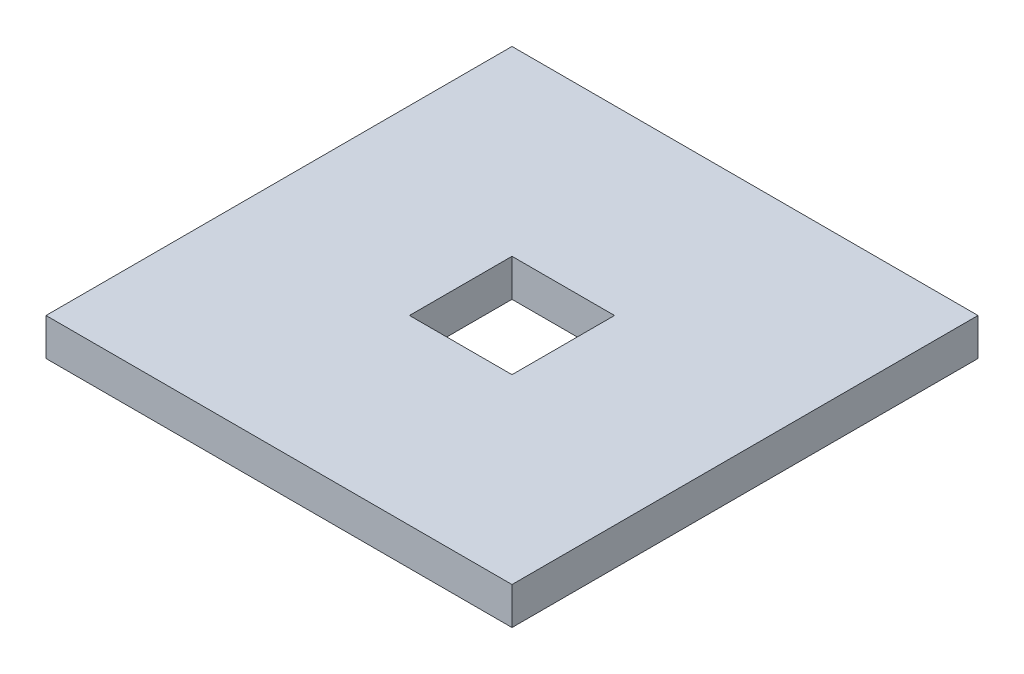
ISO-10303-21;
HEADER;
FILE_DESCRIPTION(('STEP AP214'),'2;1');
FILE_NAME('part.step','',(''),(''),'','','');
FILE_SCHEMA(('AUTOMOTIVE_DESIGN { 1 0 10303 214 1 1 1 1 }'));
ENDSEC;
DATA;
#1=APPLICATION_CONTEXT('core data for automotive mechanical design processes');
#2=APPLICATION_PROTOCOL_DEFINITION('international standard','automotive_design',2000,#1);
#3=PRODUCT_CONTEXT('',#1,'mechanical');
#4=PRODUCT('Part','Part','',(#3));
#5=PRODUCT_RELATED_PRODUCT_CATEGORY('part','',(#4));
#6=PRODUCT_DEFINITION_FORMATION('','',#4);
#7=PRODUCT_DEFINITION_CONTEXT('part definition',#1,'design');
#8=PRODUCT_DEFINITION('design','',#6,#7);
#9=PRODUCT_DEFINITION_SHAPE('','',#8);
#10=(LENGTH_UNIT() NAMED_UNIT(*) SI_UNIT(.MILLI.,.METRE.));
#11=(NAMED_UNIT(*) PLANE_ANGLE_UNIT() SI_UNIT($,.RADIAN.));
#12=(NAMED_UNIT(*) SI_UNIT($,.STERADIAN.) SOLID_ANGLE_UNIT());
#13=UNCERTAINTY_MEASURE_WITH_UNIT(LENGTH_MEASURE(1.E-05),#10,'distance_accuracy_value','');
#14=(GEOMETRIC_REPRESENTATION_CONTEXT(3) GLOBAL_UNCERTAINTY_ASSIGNED_CONTEXT((#13)) GLOBAL_UNIT_ASSIGNED_CONTEXT((#10,
#11,#12)) REPRESENTATION_CONTEXT('',''));
#15=CARTESIAN_POINT('',(0.,0.,0.));
#16=DIRECTION('',(0.,0.,1.));
#17=DIRECTION('',(1.,0.,0.));
#18=AXIS2_PLACEMENT_3D('',#15,#16,#17);
#19=CARTESIAN_POINT('',(0.,20.,0.));
#20=DIRECTION('',(0.,1.,0.));
#21=DIRECTION('',(0.,0.,1.));
#22=AXIS2_PLACEMENT_3D('',#19,#20,#21);
#23=PLANE('',#22);
#24=DIRECTION('',(0.,0.,1.));
#25=VECTOR('',#24,1.);
#26=CARTESIAN_POINT('',(-125.,20.,125.));
#27=LINE('',#26,#25);
#28=CARTESIAN_POINT('',(-125.,20.,-125.));
#29=VERTEX_POINT('',#28);
#30=CARTESIAN_POINT('',(-125.,20.,125.));
#31=VERTEX_POINT('',#30);
#32=EDGE_CURVE('E145',#29,#31,#27,.T.);
#33=ORIENTED_EDGE('',*,*,#32,.T.);
#34=DIRECTION('',(1.,0.,0.));
#35=VECTOR('',#34,1.);
#36=CARTESIAN_POINT('',(125.,20.,125.));
#37=LINE('',#36,#35);
#38=CARTESIAN_POINT('',(125.,20.,125.));
#39=VERTEX_POINT('',#38);
#40=EDGE_CURVE('E144',#31,#39,#37,.T.);
#41=ORIENTED_EDGE('',*,*,#40,.T.);
#42=DIRECTION('',(0.,0.,-1.));
#43=VECTOR('',#42,1.);
#44=CARTESIAN_POINT('',(125.,20.,125.));
#45=LINE('',#44,#43);
#46=CARTESIAN_POINT('',(125.,20.,-125.));
#47=VERTEX_POINT('',#46);
#48=EDGE_CURVE('E149',#39,#47,#45,.T.);
#49=ORIENTED_EDGE('',*,*,#48,.T.);
#50=DIRECTION('',(-1.,0.,0.));
#51=VECTOR('',#50,1.);
#52=CARTESIAN_POINT('',(125.,20.,-125.));
#53=LINE('',#52,#51);
#54=EDGE_CURVE('E148',#47,#29,#53,.T.);
#55=ORIENTED_EDGE('',*,*,#54,.T.);
#56=EDGE_LOOP('',(#33,#41,#49,#55));
#57=FACE_BOUND('',#56,.T.);
#58=DIRECTION('',(1.,0.,0.));
#59=VECTOR('',#58,1.);
#60=CARTESIAN_POINT('',(27.5,20.,27.5));
#61=LINE('',#60,#59);
#62=CARTESIAN_POINT('',(-27.5,20.,27.5));
#63=VERTEX_POINT('',#62);
#64=CARTESIAN_POINT('',(27.5,20.,27.5));
#65=VERTEX_POINT('',#64);
#66=EDGE_CURVE('E114',#63,#65,#61,.T.);
#67=ORIENTED_EDGE('',*,*,#66,.F.);
#68=DIRECTION('',(0.,0.,1.));
#69=VECTOR('',#68,1.);
#70=CARTESIAN_POINT('',(-27.5,20.,27.5));
#71=LINE('',#70,#69);
#72=CARTESIAN_POINT('',(-27.5,20.,-27.5));
#73=VERTEX_POINT('',#72);
#74=EDGE_CURVE('E108',#73,#63,#71,.T.);
#75=ORIENTED_EDGE('',*,*,#74,.F.);
#76=DIRECTION('',(-1.,0.,0.));
#77=VECTOR('',#76,1.);
#78=CARTESIAN_POINT('',(27.5,20.,-27.5));
#79=LINE('',#78,#77);
#80=CARTESIAN_POINT('',(27.5,20.,-27.5));
#81=VERTEX_POINT('',#80);
#82=EDGE_CURVE('E126',#81,#73,#79,.T.);
#83=ORIENTED_EDGE('',*,*,#82,.F.);
#84=DIRECTION('',(0.,0.,-1.));
#85=VECTOR('',#84,1.);
#86=CARTESIAN_POINT('',(27.5,20.,27.5));
#87=LINE('',#86,#85);
#88=EDGE_CURVE('E128',#65,#81,#87,.T.);
#89=ORIENTED_EDGE('',*,*,#88,.F.);
#90=EDGE_LOOP('',(#67,#75,#83,#89));
#91=FACE_BOUND('',#90,.T.);
#92=ADVANCED_FACE('F41',(#57,#91),#23,.T.);
#93=CARTESIAN_POINT('',(0.,0.,0.));
#94=DIRECTION('',(0.,1.,0.));
#95=DIRECTION('',(0.,0.,1.));
#96=AXIS2_PLACEMENT_3D('',#93,#94,#95);
#97=PLANE('',#96);
#98=DIRECTION('',(0.,0.,1.));
#99=VECTOR('',#98,1.);
#100=CARTESIAN_POINT('',(-125.,0.,125.));
#101=LINE('',#100,#99);
#102=CARTESIAN_POINT('',(-125.,0.,-125.));
#103=VERTEX_POINT('',#102);
#104=CARTESIAN_POINT('',(-125.,0.,125.));
#105=VERTEX_POINT('',#104);
#106=EDGE_CURVE('E122',#103,#105,#101,.T.);
#107=ORIENTED_EDGE('',*,*,#106,.F.);
#108=DIRECTION('',(-1.,0.,0.));
#109=VECTOR('',#108,1.);
#110=CARTESIAN_POINT('',(125.,0.,-125.));
#111=LINE('',#110,#109);
#112=CARTESIAN_POINT('',(125.,0.,-125.));
#113=VERTEX_POINT('',#112);
#114=EDGE_CURVE('E147',#113,#103,#111,.T.);
#115=ORIENTED_EDGE('',*,*,#114,.F.);
#116=DIRECTION('',(0.,0.,-1.));
#117=VECTOR('',#116,1.);
#118=CARTESIAN_POINT('',(125.,0.,125.));
#119=LINE('',#118,#117);
#120=CARTESIAN_POINT('',(125.,0.,125.));
#121=VERTEX_POINT('',#120);
#122=EDGE_CURVE('E160',#121,#113,#119,.T.);
#123=ORIENTED_EDGE('',*,*,#122,.F.);
#124=DIRECTION('',(1.,0.,0.));
#125=VECTOR('',#124,1.);
#126=CARTESIAN_POINT('',(125.,0.,125.));
#127=LINE('',#126,#125);
#128=EDGE_CURVE('E152',#105,#121,#127,.T.);
#129=ORIENTED_EDGE('',*,*,#128,.F.);
#130=EDGE_LOOP('',(#107,#115,#123,#129));
#131=FACE_BOUND('',#130,.T.);
#132=DIRECTION('',(0.,0.,1.));
#133=VECTOR('',#132,1.);
#134=CARTESIAN_POINT('',(-27.5,0.,27.5));
#135=LINE('',#134,#133);
#136=CARTESIAN_POINT('',(-27.5,0.,-27.5));
#137=VERTEX_POINT('',#136);
#138=CARTESIAN_POINT('',(-27.5,0.,27.5));
#139=VERTEX_POINT('',#138);
#140=EDGE_CURVE('E64',#137,#139,#135,.T.);
#141=ORIENTED_EDGE('',*,*,#140,.T.);
#142=DIRECTION('',(1.,0.,0.));
#143=VECTOR('',#142,1.);
#144=CARTESIAN_POINT('',(27.5,0.,27.5));
#145=LINE('',#144,#143);
#146=CARTESIAN_POINT('',(27.5,0.,27.5));
#147=VERTEX_POINT('',#146);
#148=EDGE_CURVE('E123',#139,#147,#145,.T.);
#149=ORIENTED_EDGE('',*,*,#148,.T.);
#150=DIRECTION('',(0.,0.,-1.));
#151=VECTOR('',#150,1.);
#152=CARTESIAN_POINT('',(27.5,0.,27.5));
#153=LINE('',#152,#151);
#154=CARTESIAN_POINT('',(27.5,0.,-27.5));
#155=VERTEX_POINT('',#154);
#156=EDGE_CURVE('E132',#147,#155,#153,.T.);
#157=ORIENTED_EDGE('',*,*,#156,.T.);
#158=DIRECTION('',(-1.,0.,0.));
#159=VECTOR('',#158,1.);
#160=CARTESIAN_POINT('',(27.5,0.,-27.5));
#161=LINE('',#160,#159);
#162=EDGE_CURVE('E113',#155,#137,#161,.T.);
#163=ORIENTED_EDGE('',*,*,#162,.T.);
#164=EDGE_LOOP('',(#141,#149,#157,#163));
#165=FACE_BOUND('',#164,.T.);
#166=ADVANCED_FACE('F172',(#131,#165),#97,.F.);
#167=CARTESIAN_POINT('',(-125.,20.,125.));
#168=DIRECTION('',(1.,0.,0.));
#169=DIRECTION('',(0.,0.,-1.));
#170=AXIS2_PLACEMENT_3D('',#167,#168,#169);
#171=PLANE('',#170);
#172=ORIENTED_EDGE('',*,*,#106,.T.);
#173=DIRECTION('',(0.,-1.,0.));
#174=VECTOR('',#173,1.);
#175=CARTESIAN_POINT('',(-125.,20.,125.));
#176=LINE('',#175,#174);
#177=EDGE_CURVE('E11',#31,#105,#176,.T.);
#178=ORIENTED_EDGE('',*,*,#177,.F.);
#179=ORIENTED_EDGE('',*,*,#32,.F.);
#180=DIRECTION('',(0.,-1.,0.));
#181=VECTOR('',#180,1.);
#182=CARTESIAN_POINT('',(-125.,20.,-125.));
#183=LINE('',#182,#181);
#184=EDGE_CURVE('E155',#29,#103,#183,.T.);
#185=ORIENTED_EDGE('',*,*,#184,.T.);
#186=EDGE_LOOP('',(#172,#178,#179,#185));
#187=FACE_BOUND('',#186,.T.);
#188=ADVANCED_FACE('F43',(#187),#171,.F.);
#189=CARTESIAN_POINT('',(125.,20.,125.));
#190=DIRECTION('',(0.,0.,-1.));
#191=DIRECTION('',(-1.,0.,0.));
#192=AXIS2_PLACEMENT_3D('',#189,#190,#191);
#193=PLANE('',#192);
#194=ORIENTED_EDGE('',*,*,#128,.T.);
#195=DIRECTION('',(0.,-1.,0.));
#196=VECTOR('',#195,1.);
#197=CARTESIAN_POINT('',(125.,20.,125.));
#198=LINE('',#197,#196);
#199=EDGE_CURVE('E47',#39,#121,#198,.T.);
#200=ORIENTED_EDGE('',*,*,#199,.F.);
#201=ORIENTED_EDGE('',*,*,#40,.F.);
#202=ORIENTED_EDGE('',*,*,#177,.T.);
#203=EDGE_LOOP('',(#194,#200,#201,#202));
#204=FACE_BOUND('',#203,.T.);
#205=ADVANCED_FACE('F184',(#204),#193,.F.);
#206=CARTESIAN_POINT('',(125.,20.,125.));
#207=DIRECTION('',(-1.,0.,0.));
#208=DIRECTION('',(0.,0.,1.));
#209=AXIS2_PLACEMENT_3D('',#206,#207,#208);
#210=PLANE('',#209);
#211=ORIENTED_EDGE('',*,*,#122,.T.);
#212=DIRECTION('',(0.,-1.,0.));
#213=VECTOR('',#212,1.);
#214=CARTESIAN_POINT('',(125.,20.,-125.));
#215=LINE('',#214,#213);
#216=EDGE_CURVE('E162',#47,#113,#215,.T.);
#217=ORIENTED_EDGE('',*,*,#216,.F.);
#218=ORIENTED_EDGE('',*,*,#48,.F.);
#219=ORIENTED_EDGE('',*,*,#199,.T.);
#220=EDGE_LOOP('',(#211,#217,#218,#219));
#221=FACE_BOUND('',#220,.T.);
#222=ADVANCED_FACE('F170',(#221),#210,.F.);
#223=CARTESIAN_POINT('',(125.,20.,-125.));
#224=DIRECTION('',(0.,0.,1.));
#225=DIRECTION('',(1.,0.,0.));
#226=AXIS2_PLACEMENT_3D('',#223,#224,#225);
#227=PLANE('',#226);
#228=ORIENTED_EDGE('',*,*,#114,.T.);
#229=ORIENTED_EDGE('',*,*,#184,.F.);
#230=ORIENTED_EDGE('',*,*,#54,.F.);
#231=ORIENTED_EDGE('',*,*,#216,.T.);
#232=EDGE_LOOP('',(#228,#229,#230,#231));
#233=FACE_BOUND('',#232,.T.);
#234=ADVANCED_FACE('F177',(#233),#227,.F.);
#235=CARTESIAN_POINT('',(-27.5,20.,27.5));
#236=DIRECTION('',(1.,0.,0.));
#237=DIRECTION('',(0.,0.,-1.));
#238=AXIS2_PLACEMENT_3D('',#235,#236,#237);
#239=PLANE('',#238);
#240=ORIENTED_EDGE('',*,*,#140,.F.);
#241=DIRECTION('',(0.,-1.,0.));
#242=VECTOR('',#241,1.);
#243=CARTESIAN_POINT('',(-27.5,20.,-27.5));
#244=LINE('',#243,#242);
#245=EDGE_CURVE('E107',#73,#137,#244,.T.);
#246=ORIENTED_EDGE('',*,*,#245,.F.);
#247=ORIENTED_EDGE('',*,*,#74,.T.);
#248=DIRECTION('',(0.,-1.,0.));
#249=VECTOR('',#248,1.);
#250=CARTESIAN_POINT('',(-27.5,20.,27.5));
#251=LINE('',#250,#249);
#252=EDGE_CURVE('E109',#63,#139,#251,.T.);
#253=ORIENTED_EDGE('',*,*,#252,.T.);
#254=EDGE_LOOP('',(#240,#246,#247,#253));
#255=FACE_BOUND('',#254,.T.);
#256=ADVANCED_FACE('F106',(#255),#239,.T.);
#257=CARTESIAN_POINT('',(27.5,20.,27.5));
#258=DIRECTION('',(0.,0.,-1.));
#259=DIRECTION('',(-1.,0.,0.));
#260=AXIS2_PLACEMENT_3D('',#257,#258,#259);
#261=PLANE('',#260);
#262=ORIENTED_EDGE('',*,*,#148,.F.);
#263=ORIENTED_EDGE('',*,*,#252,.F.);
#264=ORIENTED_EDGE('',*,*,#66,.T.);
#265=DIRECTION('',(0.,-1.,0.));
#266=VECTOR('',#265,1.);
#267=CARTESIAN_POINT('',(27.5,20.,27.5));
#268=LINE('',#267,#266);
#269=EDGE_CURVE('E121',#65,#147,#268,.T.);
#270=ORIENTED_EDGE('',*,*,#269,.T.);
#271=EDGE_LOOP('',(#262,#263,#264,#270));
#272=FACE_BOUND('',#271,.T.);
#273=ADVANCED_FACE('F119',(#272),#261,.T.);
#274=CARTESIAN_POINT('',(27.5,20.,27.5));
#275=DIRECTION('',(-1.,0.,0.));
#276=DIRECTION('',(0.,0.,1.));
#277=AXIS2_PLACEMENT_3D('',#274,#275,#276);
#278=PLANE('',#277);
#279=ORIENTED_EDGE('',*,*,#156,.F.);
#280=ORIENTED_EDGE('',*,*,#269,.F.);
#281=ORIENTED_EDGE('',*,*,#88,.T.);
#282=DIRECTION('',(0.,-1.,0.));
#283=VECTOR('',#282,1.);
#284=CARTESIAN_POINT('',(27.5,20.,-27.5));
#285=LINE('',#284,#283);
#286=EDGE_CURVE('E57',#81,#155,#285,.T.);
#287=ORIENTED_EDGE('',*,*,#286,.T.);
#288=EDGE_LOOP('',(#279,#280,#281,#287));
#289=FACE_BOUND('',#288,.T.);
#290=ADVANCED_FACE('F209',(#289),#278,.T.);
#291=CARTESIAN_POINT('',(27.5,20.,-27.5));
#292=DIRECTION('',(0.,0.,1.));
#293=DIRECTION('',(1.,0.,0.));
#294=AXIS2_PLACEMENT_3D('',#291,#292,#293);
#295=PLANE('',#294);
#296=ORIENTED_EDGE('',*,*,#162,.F.);
#297=ORIENTED_EDGE('',*,*,#286,.F.);
#298=ORIENTED_EDGE('',*,*,#82,.T.);
#299=ORIENTED_EDGE('',*,*,#245,.T.);
#300=EDGE_LOOP('',(#296,#297,#298,#299));
#301=FACE_BOUND('',#300,.T.);
#302=ADVANCED_FACE('F212',(#301),#295,.T.);
#303=CLOSED_SHELL('',(#92,#166,#188,#205,#222,#234,#256,#273,#290,#302));
#304=MANIFOLD_SOLID_BREP('B2',#303);
#305=ADVANCED_BREP_SHAPE_REPRESENTATION('',(#18,#304),#14);
#306=SHAPE_DEFINITION_REPRESENTATION(#9,#305);
ENDSEC;
END-ISO-10303-21;
